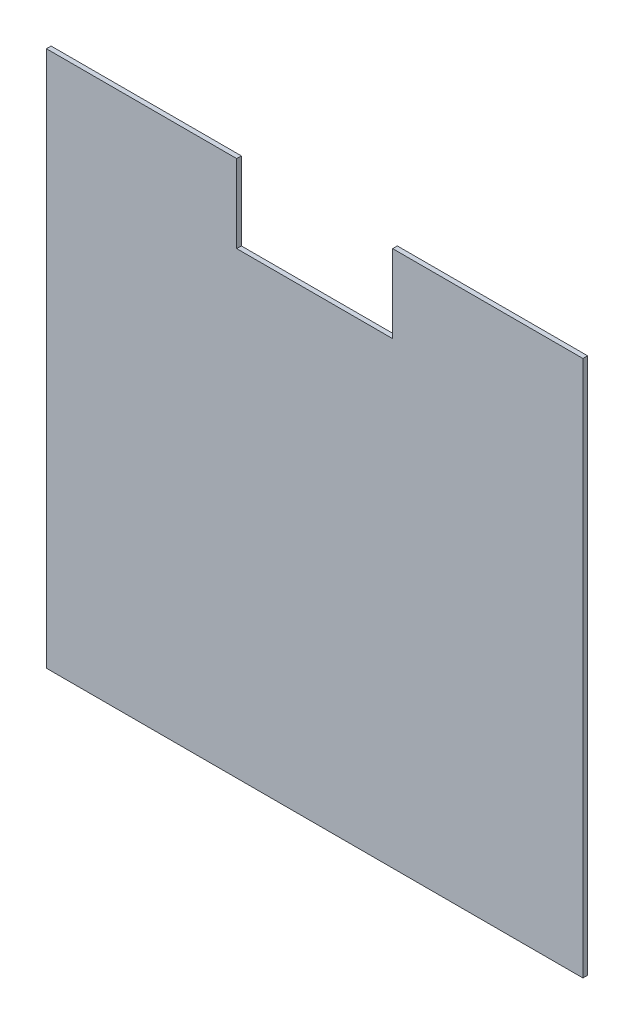
ISO-10303-21;
HEADER;
FILE_DESCRIPTION(('STEP AP214'),'2;1');
FILE_NAME('part.step','',(''),(''),'','','');
FILE_SCHEMA(('AUTOMOTIVE_DESIGN { 1 0 10303 214 1 1 1 1 }'));
ENDSEC;
DATA;
#1=APPLICATION_CONTEXT('core data for automotive mechanical design processes');
#2=APPLICATION_PROTOCOL_DEFINITION('international standard','automotive_design',2000,#1);
#3=PRODUCT_CONTEXT('',#1,'mechanical');
#4=PRODUCT('Part','Part','',(#3));
#5=PRODUCT_RELATED_PRODUCT_CATEGORY('part','',(#4));
#6=PRODUCT_DEFINITION_FORMATION('','',#4);
#7=PRODUCT_DEFINITION_CONTEXT('part definition',#1,'design');
#8=PRODUCT_DEFINITION('design','',#6,#7);
#9=PRODUCT_DEFINITION_SHAPE('','',#8);
#10=(LENGTH_UNIT() NAMED_UNIT(*) SI_UNIT(.MILLI.,.METRE.));
#11=(NAMED_UNIT(*) PLANE_ANGLE_UNIT() SI_UNIT($,.RADIAN.));
#12=(NAMED_UNIT(*) SI_UNIT($,.STERADIAN.) SOLID_ANGLE_UNIT());
#13=UNCERTAINTY_MEASURE_WITH_UNIT(LENGTH_MEASURE(1.E-05),#10,'distance_accuracy_value','');
#14=(GEOMETRIC_REPRESENTATION_CONTEXT(3) GLOBAL_UNCERTAINTY_ASSIGNED_CONTEXT((#13)) GLOBAL_UNIT_ASSIGNED_CONTEXT((#10,
#11,#12)) REPRESENTATION_CONTEXT('',''));
#15=CARTESIAN_POINT('',(0.,0.,0.));
#16=DIRECTION('',(0.,0.,1.));
#17=DIRECTION('',(1.,0.,0.));
#18=AXIS2_PLACEMENT_3D('',#15,#16,#17);
#19=CARTESIAN_POINT('',(344.,0.,3.));
#20=DIRECTION('',(0.,1.,0.));
#21=DIRECTION('',(-1.,0.,0.));
#22=AXIS2_PLACEMENT_3D('',#19,#20,#21);
#23=PLANE('',#22);
#24=DIRECTION('',(1.,0.,0.));
#25=VECTOR('',#24,1.);
#26=CARTESIAN_POINT('',(344.,0.,0.));
#27=LINE('',#26,#25);
#28=CARTESIAN_POINT('',(0.,0.,0.));
#29=VERTEX_POINT('',#28);
#30=CARTESIAN_POINT('',(344.,0.,0.));
#31=VERTEX_POINT('',#30);
#32=EDGE_CURVE('E130',#29,#31,#27,.T.);
#33=ORIENTED_EDGE('',*,*,#32,.T.);
#34=DIRECTION('',(0.,0.,-1.));
#35=VECTOR('',#34,1.);
#36=CARTESIAN_POINT('',(344.,0.,3.));
#37=LINE('',#36,#35);
#38=CARTESIAN_POINT('',(344.,0.,3.));
#39=VERTEX_POINT('',#38);
#40=EDGE_CURVE('E11',#39,#31,#37,.T.);
#41=ORIENTED_EDGE('',*,*,#40,.F.);
#42=DIRECTION('',(1.,0.,0.));
#43=VECTOR('',#42,1.);
#44=CARTESIAN_POINT('',(344.,0.,3.));
#45=LINE('',#44,#43);
#46=CARTESIAN_POINT('',(0.,0.,3.));
#47=VERTEX_POINT('',#46);
#48=EDGE_CURVE('E144',#47,#39,#45,.T.);
#49=ORIENTED_EDGE('',*,*,#48,.F.);
#50=DIRECTION('',(0.,0.,-1.));
#51=VECTOR('',#50,1.);
#52=CARTESIAN_POINT('',(0.,0.,3.));
#53=LINE('',#52,#51);
#54=EDGE_CURVE('E126',#47,#29,#53,.T.);
#55=ORIENTED_EDGE('',*,*,#54,.T.);
#56=EDGE_LOOP('',(#33,#41,#49,#55));
#57=FACE_BOUND('',#56,.T.);
#58=ADVANCED_FACE('F34',(#57),#23,.F.);
#59=CARTESIAN_POINT('',(344.,344.,3.));
#60=DIRECTION('',(-1.,0.,0.));
#61=DIRECTION('',(0.,0.,1.));
#62=AXIS2_PLACEMENT_3D('',#59,#60,#61);
#63=PLANE('',#62);
#64=DIRECTION('',(0.,1.,0.));
#65=VECTOR('',#64,1.);
#66=CARTESIAN_POINT('',(344.,344.,0.));
#67=LINE('',#66,#65);
#68=CARTESIAN_POINT('',(344.,344.,0.));
#69=VERTEX_POINT('',#68);
#70=EDGE_CURVE('E133',#31,#69,#67,.T.);
#71=ORIENTED_EDGE('',*,*,#70,.T.);
#72=DIRECTION('',(0.,0.,-1.));
#73=VECTOR('',#72,1.);
#74=CARTESIAN_POINT('',(344.,344.,3.));
#75=LINE('',#74,#73);
#76=CARTESIAN_POINT('',(344.,344.,3.));
#77=VERTEX_POINT('',#76);
#78=EDGE_CURVE('E42',#77,#69,#75,.T.);
#79=ORIENTED_EDGE('',*,*,#78,.F.);
#80=DIRECTION('',(0.,1.,0.));
#81=VECTOR('',#80,1.);
#82=CARTESIAN_POINT('',(344.,344.,3.));
#83=LINE('',#82,#81);
#84=EDGE_CURVE('E93',#39,#77,#83,.T.);
#85=ORIENTED_EDGE('',*,*,#84,.F.);
#86=ORIENTED_EDGE('',*,*,#40,.T.);
#87=EDGE_LOOP('',(#71,#79,#85,#86));
#88=FACE_BOUND('',#87,.T.);
#89=ADVANCED_FACE('F179',(#88),#63,.F.);
#90=CARTESIAN_POINT('',(222.,344.,3.));
#91=DIRECTION('',(0.,-1.,0.));
#92=DIRECTION('',(0.,0.,-1.));
#93=AXIS2_PLACEMENT_3D('',#90,#91,#92);
#94=PLANE('',#93);
#95=DIRECTION('',(-1.,0.,0.));
#96=VECTOR('',#95,1.);
#97=CARTESIAN_POINT('',(222.,344.,0.));
#98=LINE('',#97,#96);
#99=CARTESIAN_POINT('',(222.,344.,0.));
#100=VERTEX_POINT('',#99);
#101=EDGE_CURVE('E135',#69,#100,#98,.T.);
#102=ORIENTED_EDGE('',*,*,#101,.T.);
#103=DIRECTION('',(0.,0.,-1.));
#104=VECTOR('',#103,1.);
#105=CARTESIAN_POINT('',(222.,344.,3.));
#106=LINE('',#105,#104);
#107=CARTESIAN_POINT('',(222.,344.,3.));
#108=VERTEX_POINT('',#107);
#109=EDGE_CURVE('E151',#108,#100,#106,.T.);
#110=ORIENTED_EDGE('',*,*,#109,.F.);
#111=DIRECTION('',(-1.,0.,0.));
#112=VECTOR('',#111,1.);
#113=CARTESIAN_POINT('',(222.,344.,3.));
#114=LINE('',#113,#112);
#115=EDGE_CURVE('E159',#77,#108,#114,.T.);
#116=ORIENTED_EDGE('',*,*,#115,.F.);
#117=ORIENTED_EDGE('',*,*,#78,.T.);
#118=EDGE_LOOP('',(#102,#110,#116,#117));
#119=FACE_BOUND('',#118,.T.);
#120=ADVANCED_FACE('F157',(#119),#94,.F.);
#121=CARTESIAN_POINT('',(222.,294.,3.));
#122=DIRECTION('',(1.,0.,0.));
#123=DIRECTION('',(0.,0.,-1.));
#124=AXIS2_PLACEMENT_3D('',#121,#122,#123);
#125=PLANE('',#124);
#126=DIRECTION('',(0.,-1.,0.));
#127=VECTOR('',#126,1.);
#128=CARTESIAN_POINT('',(222.,294.,0.));
#129=LINE('',#128,#127);
#130=CARTESIAN_POINT('',(222.,294.,0.));
#131=VERTEX_POINT('',#130);
#132=EDGE_CURVE('E137',#100,#131,#129,.T.);
#133=ORIENTED_EDGE('',*,*,#132,.T.);
#134=DIRECTION('',(0.,0.,-1.));
#135=VECTOR('',#134,1.);
#136=CARTESIAN_POINT('',(222.,294.,3.));
#137=LINE('',#136,#135);
#138=CARTESIAN_POINT('',(222.,294.,3.));
#139=VERTEX_POINT('',#138);
#140=EDGE_CURVE('E148',#139,#131,#137,.T.);
#141=ORIENTED_EDGE('',*,*,#140,.F.);
#142=DIRECTION('',(0.,-1.,0.));
#143=VECTOR('',#142,1.);
#144=CARTESIAN_POINT('',(222.,294.,3.));
#145=LINE('',#144,#143);
#146=EDGE_CURVE('E171',#108,#139,#145,.T.);
#147=ORIENTED_EDGE('',*,*,#146,.F.);
#148=ORIENTED_EDGE('',*,*,#109,.T.);
#149=EDGE_LOOP('',(#133,#141,#147,#148));
#150=FACE_BOUND('',#149,.T.);
#151=ADVANCED_FACE('F167',(#150),#125,.F.);
#152=CARTESIAN_POINT('',(122.,294.,3.));
#153=DIRECTION('',(0.,-1.,0.));
#154=DIRECTION('',(0.,0.,-1.));
#155=AXIS2_PLACEMENT_3D('',#152,#153,#154);
#156=PLANE('',#155);
#157=DIRECTION('',(-1.,0.,0.));
#158=VECTOR('',#157,1.);
#159=CARTESIAN_POINT('',(122.,294.,0.));
#160=LINE('',#159,#158);
#161=CARTESIAN_POINT('',(122.,294.,0.));
#162=VERTEX_POINT('',#161);
#163=EDGE_CURVE('E139',#131,#162,#160,.T.);
#164=ORIENTED_EDGE('',*,*,#163,.T.);
#165=DIRECTION('',(0.,0.,-1.));
#166=VECTOR('',#165,1.);
#167=CARTESIAN_POINT('',(122.,294.,3.));
#168=LINE('',#167,#166);
#169=CARTESIAN_POINT('',(122.,294.,3.));
#170=VERTEX_POINT('',#169);
#171=EDGE_CURVE('E121',#170,#162,#168,.T.);
#172=ORIENTED_EDGE('',*,*,#171,.F.);
#173=DIRECTION('',(-1.,0.,0.));
#174=VECTOR('',#173,1.);
#175=CARTESIAN_POINT('',(122.,294.,3.));
#176=LINE('',#175,#174);
#177=EDGE_CURVE('E112',#139,#170,#176,.T.);
#178=ORIENTED_EDGE('',*,*,#177,.F.);
#179=ORIENTED_EDGE('',*,*,#140,.T.);
#180=EDGE_LOOP('',(#164,#172,#178,#179));
#181=FACE_BOUND('',#180,.T.);
#182=ADVANCED_FACE('F170',(#181),#156,.F.);
#183=CARTESIAN_POINT('',(122.,344.,3.));
#184=DIRECTION('',(-1.,0.,0.));
#185=DIRECTION('',(0.,-1.,0.));
#186=AXIS2_PLACEMENT_3D('',#183,#184,#185);
#187=PLANE('',#186);
#188=DIRECTION('',(0.,1.,0.));
#189=VECTOR('',#188,1.);
#190=CARTESIAN_POINT('',(122.,344.,0.));
#191=LINE('',#190,#189);
#192=CARTESIAN_POINT('',(122.,344.,0.));
#193=VERTEX_POINT('',#192);
#194=EDGE_CURVE('E120',#162,#193,#191,.T.);
#195=ORIENTED_EDGE('',*,*,#194,.T.);
#196=DIRECTION('',(0.,0.,-1.));
#197=VECTOR('',#196,1.);
#198=CARTESIAN_POINT('',(122.,344.,3.));
#199=LINE('',#198,#197);
#200=CARTESIAN_POINT('',(122.,344.,3.));
#201=VERTEX_POINT('',#200);
#202=EDGE_CURVE('E117',#201,#193,#199,.T.);
#203=ORIENTED_EDGE('',*,*,#202,.F.);
#204=DIRECTION('',(0.,1.,0.));
#205=VECTOR('',#204,1.);
#206=CARTESIAN_POINT('',(122.,344.,3.));
#207=LINE('',#206,#205);
#208=EDGE_CURVE('E106',#170,#201,#207,.T.);
#209=ORIENTED_EDGE('',*,*,#208,.F.);
#210=ORIENTED_EDGE('',*,*,#171,.T.);
#211=EDGE_LOOP('',(#195,#203,#209,#210));
#212=FACE_BOUND('',#211,.T.);
#213=ADVANCED_FACE('F118',(#212),#187,.F.);
#214=CARTESIAN_POINT('',(0.,344.,3.));
#215=DIRECTION('',(0.,-1.,0.));
#216=DIRECTION('',(0.,0.,-1.));
#217=AXIS2_PLACEMENT_3D('',#214,#215,#216);
#218=PLANE('',#217);
#219=DIRECTION('',(-1.,0.,0.));
#220=VECTOR('',#219,1.);
#221=CARTESIAN_POINT('',(0.,344.,0.));
#222=LINE('',#221,#220);
#223=CARTESIAN_POINT('',(0.,344.,0.));
#224=VERTEX_POINT('',#223);
#225=EDGE_CURVE('E79',#193,#224,#222,.T.);
#226=ORIENTED_EDGE('',*,*,#225,.T.);
#227=DIRECTION('',(0.,0.,-1.));
#228=VECTOR('',#227,1.);
#229=CARTESIAN_POINT('',(0.,344.,3.));
#230=LINE('',#229,#228);
#231=CARTESIAN_POINT('',(0.,344.,3.));
#232=VERTEX_POINT('',#231);
#233=EDGE_CURVE('E122',#232,#224,#230,.T.);
#234=ORIENTED_EDGE('',*,*,#233,.F.);
#235=DIRECTION('',(-1.,0.,0.));
#236=VECTOR('',#235,1.);
#237=CARTESIAN_POINT('',(0.,344.,3.));
#238=LINE('',#237,#236);
#239=EDGE_CURVE('E110',#201,#232,#238,.T.);
#240=ORIENTED_EDGE('',*,*,#239,.F.);
#241=ORIENTED_EDGE('',*,*,#202,.T.);
#242=EDGE_LOOP('',(#226,#234,#240,#241));
#243=FACE_BOUND('',#242,.T.);
#244=ADVANCED_FACE('F124',(#243),#218,.F.);
#245=CARTESIAN_POINT('',(0.,0.,3.));
#246=DIRECTION('',(1.,0.,0.));
#247=DIRECTION('',(0.,0.,-1.));
#248=AXIS2_PLACEMENT_3D('',#245,#246,#247);
#249=PLANE('',#248);
#250=DIRECTION('',(0.,-1.,0.));
#251=VECTOR('',#250,1.);
#252=CARTESIAN_POINT('',(0.,0.,0.));
#253=LINE('',#252,#251);
#254=EDGE_CURVE('E85',#224,#29,#253,.T.);
#255=ORIENTED_EDGE('',*,*,#254,.T.);
#256=ORIENTED_EDGE('',*,*,#54,.F.);
#257=DIRECTION('',(0.,-1.,0.));
#258=VECTOR('',#257,1.);
#259=CARTESIAN_POINT('',(0.,0.,3.));
#260=LINE('',#259,#258);
#261=EDGE_CURVE('E50',#232,#47,#260,.T.);
#262=ORIENTED_EDGE('',*,*,#261,.F.);
#263=ORIENTED_EDGE('',*,*,#233,.T.);
#264=EDGE_LOOP('',(#255,#256,#262,#263));
#265=FACE_BOUND('',#264,.T.);
#266=ADVANCED_FACE('F195',(#265),#249,.F.);
#267=CARTESIAN_POINT('',(0.,0.,3.));
#268=DIRECTION('',(0.,0.,-1.));
#269=DIRECTION('',(-1.,0.,0.));
#270=AXIS2_PLACEMENT_3D('',#267,#268,#269);
#271=PLANE('',#270);
#272=ORIENTED_EDGE('',*,*,#48,.T.);
#273=ORIENTED_EDGE('',*,*,#84,.T.);
#274=ORIENTED_EDGE('',*,*,#115,.T.);
#275=ORIENTED_EDGE('',*,*,#146,.T.);
#276=ORIENTED_EDGE('',*,*,#177,.T.);
#277=ORIENTED_EDGE('',*,*,#208,.T.);
#278=ORIENTED_EDGE('',*,*,#239,.T.);
#279=ORIENTED_EDGE('',*,*,#261,.T.);
#280=EDGE_LOOP('',(#272,#273,#274,#275,#276,#277,#278,#279));
#281=FACE_BOUND('',#280,.T.);
#282=ADVANCED_FACE('F108',(#281),#271,.F.);
#283=CARTESIAN_POINT('',(0.,0.,0.));
#284=DIRECTION('',(0.,0.,-1.));
#285=DIRECTION('',(-1.,0.,0.));
#286=AXIS2_PLACEMENT_3D('',#283,#284,#285);
#287=PLANE('',#286);
#288=ORIENTED_EDGE('',*,*,#32,.F.);
#289=ORIENTED_EDGE('',*,*,#254,.F.);
#290=ORIENTED_EDGE('',*,*,#225,.F.);
#291=ORIENTED_EDGE('',*,*,#194,.F.);
#292=ORIENTED_EDGE('',*,*,#163,.F.);
#293=ORIENTED_EDGE('',*,*,#132,.F.);
#294=ORIENTED_EDGE('',*,*,#101,.F.);
#295=ORIENTED_EDGE('',*,*,#70,.F.);
#296=EDGE_LOOP('',(#288,#289,#290,#291,#292,#293,#294,#295));
#297=FACE_BOUND('',#296,.T.);
#298=ADVANCED_FACE('F163',(#297),#287,.T.);
#299=CLOSED_SHELL('',(#58,#89,#120,#151,#182,#213,#244,#266,#282,#298));
#300=MANIFOLD_SOLID_BREP('B2',#299);
#301=ADVANCED_BREP_SHAPE_REPRESENTATION('',(#18,#300),#14);
#302=SHAPE_DEFINITION_REPRESENTATION(#9,#301);
ENDSEC;
END-ISO-10303-21;
